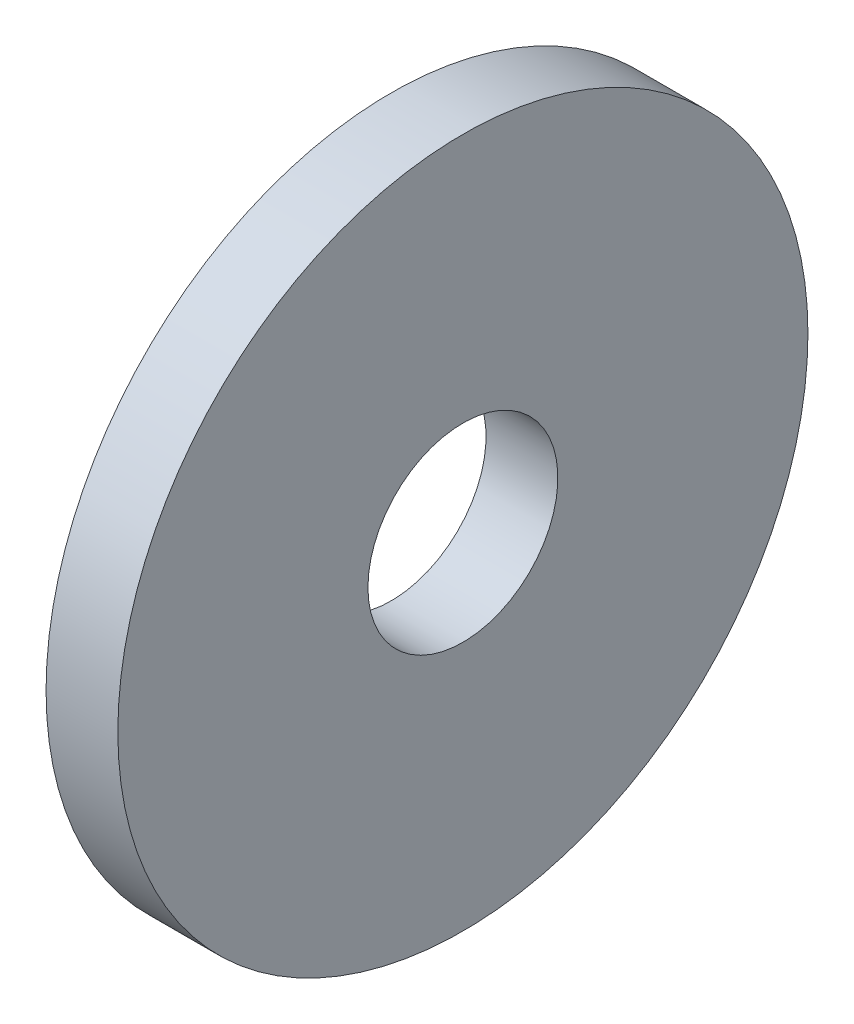
ISO-10303-21;
HEADER;
FILE_DESCRIPTION(('STEP AP214'),'2;1');
FILE_NAME('part.step','',(''),(''),'','','');
FILE_SCHEMA(('AUTOMOTIVE_DESIGN { 1 0 10303 214 1 1 1 1 }'));
ENDSEC;
DATA;
#1=APPLICATION_CONTEXT('core data for automotive mechanical design processes');
#2=APPLICATION_PROTOCOL_DEFINITION('international standard','automotive_design',2000,#1);
#3=PRODUCT_CONTEXT('',#1,'mechanical');
#4=PRODUCT('Part','Part','',(#3));
#5=PRODUCT_RELATED_PRODUCT_CATEGORY('part','',(#4));
#6=PRODUCT_DEFINITION_FORMATION('','',#4);
#7=PRODUCT_DEFINITION_CONTEXT('part definition',#1,'design');
#8=PRODUCT_DEFINITION('design','',#6,#7);
#9=PRODUCT_DEFINITION_SHAPE('','',#8);
#10=(LENGTH_UNIT() NAMED_UNIT(*) SI_UNIT(.MILLI.,.METRE.));
#11=(NAMED_UNIT(*) PLANE_ANGLE_UNIT() SI_UNIT($,.RADIAN.));
#12=(NAMED_UNIT(*) SI_UNIT($,.STERADIAN.) SOLID_ANGLE_UNIT());
#13=UNCERTAINTY_MEASURE_WITH_UNIT(LENGTH_MEASURE(1.E-05),#10,'distance_accuracy_value','');
#14=(GEOMETRIC_REPRESENTATION_CONTEXT(3) GLOBAL_UNCERTAINTY_ASSIGNED_CONTEXT((#13)) GLOBAL_UNIT_ASSIGNED_CONTEXT((#10,
#11,#12)) REPRESENTATION_CONTEXT('',''));
#15=CARTESIAN_POINT('',(0.,0.,0.));
#16=DIRECTION('',(0.,0.,1.));
#17=DIRECTION('',(1.,0.,0.));
#18=AXIS2_PLACEMENT_3D('',#15,#16,#17);
#19=CARTESIAN_POINT('',(3.302,0.,0.));
#20=DIRECTION('',(1.,0.,0.));
#21=DIRECTION('',(0.,0.,-1.));
#22=AXIS2_PLACEMENT_3D('',#19,#20,#21);
#23=PLANE('',#22);
#24=CARTESIAN_POINT('',(3.302,0.,0.));
#25=DIRECTION('',(1.,0.,0.));
#26=DIRECTION('',(0.,0.,-1.));
#27=AXIS2_PLACEMENT_3D('',#24,#25,#26);
#28=CIRCLE('',#27,15.875);
#29=CARTESIAN_POINT('',(3.302,0.,15.875));
#30=VERTEX_POINT('',#29);
#31=EDGE_CURVE('E10',#30,#30,#28,.T.);
#32=ORIENTED_EDGE('',*,*,#31,.T.);
#33=EDGE_LOOP('',(#32));
#34=FACE_BOUND('',#33,.T.);
#35=CARTESIAN_POINT('',(3.302,0.,0.));
#36=DIRECTION('',(1.,0.,0.));
#37=DIRECTION('',(0.,0.,-1.));
#38=AXIS2_PLACEMENT_3D('',#35,#36,#37);
#39=CIRCLE('',#38,4.3688);
#40=CARTESIAN_POINT('',(3.302,0.,4.3688));
#41=VERTEX_POINT('',#40);
#42=EDGE_CURVE('E41',#41,#41,#39,.T.);
#43=ORIENTED_EDGE('',*,*,#42,.F.);
#44=EDGE_LOOP('',(#43));
#45=FACE_BOUND('',#44,.T.);
#46=ADVANCED_FACE('F30',(#34,#45),#23,.T.);
#47=CARTESIAN_POINT('',(0.,0.,0.));
#48=DIRECTION('',(1.,0.,0.));
#49=DIRECTION('',(0.,0.,-1.));
#50=AXIS2_PLACEMENT_3D('',#47,#48,#49);
#51=PLANE('',#50);
#52=CARTESIAN_POINT('',(0.,0.,0.));
#53=DIRECTION('',(1.,0.,0.));
#54=DIRECTION('',(0.,0.,-1.));
#55=AXIS2_PLACEMENT_3D('',#52,#53,#54);
#56=CIRCLE('',#55,15.875);
#57=CARTESIAN_POINT('',(0.,0.,15.875));
#58=VERTEX_POINT('',#57);
#59=EDGE_CURVE('E34',#58,#58,#56,.T.);
#60=ORIENTED_EDGE('',*,*,#59,.F.);
#61=EDGE_LOOP('',(#60));
#62=FACE_BOUND('',#61,.T.);
#63=CARTESIAN_POINT('',(0.,0.,0.));
#64=DIRECTION('',(1.,0.,0.));
#65=DIRECTION('',(0.,0.,-1.));
#66=AXIS2_PLACEMENT_3D('',#63,#64,#65);
#67=CIRCLE('',#66,4.3688);
#68=CARTESIAN_POINT('',(0.,0.,4.3688));
#69=VERTEX_POINT('',#68);
#70=EDGE_CURVE('E43',#69,#69,#67,.T.);
#71=ORIENTED_EDGE('',*,*,#70,.T.);
#72=EDGE_LOOP('',(#71));
#73=FACE_BOUND('',#72,.T.);
#74=ADVANCED_FACE('F53',(#62,#73),#51,.F.);
#75=CARTESIAN_POINT('',(3.302,0.,0.));
#76=DIRECTION('',(-1.,0.,0.));
#77=DIRECTION('',(0.,0.,1.));
#78=AXIS2_PLACEMENT_3D('',#75,#76,#77);
#79=CYLINDRICAL_SURFACE('',#78,15.875);
#80=CARTESIAN_POINT('',(3.302,0.,15.875));
#81=CARTESIAN_POINT('',(3.26760416666667,0.,15.875));
#82=CARTESIAN_POINT('',(3.23320833333333,0.,15.875));
#83=CARTESIAN_POINT('',(3.16441666666667,0.,15.875));
#84=CARTESIAN_POINT('',(3.13002083333333,0.,15.875));
#85=CARTESIAN_POINT('',(3.06122916666667,0.,15.875));
#86=CARTESIAN_POINT('',(3.02683333333333,0.,15.875));
#87=CARTESIAN_POINT('',(2.95804166666667,0.,15.875));
#88=CARTESIAN_POINT('',(2.92364583333333,0.,15.875));
#89=CARTESIAN_POINT('',(2.85485416666667,0.,15.875));
#90=CARTESIAN_POINT('',(2.82045833333333,0.,15.875));
#91=CARTESIAN_POINT('',(2.75166666666667,0.,15.875));
#92=CARTESIAN_POINT('',(2.71727083333333,0.,15.875));
#93=CARTESIAN_POINT('',(2.64847916666667,0.,15.875));
#94=CARTESIAN_POINT('',(2.61408333333333,0.,15.875));
#95=CARTESIAN_POINT('',(2.54529166666667,0.,15.875));
#96=CARTESIAN_POINT('',(2.51089583333333,0.,15.875));
#97=CARTESIAN_POINT('',(2.44210416666667,0.,15.875));
#98=CARTESIAN_POINT('',(2.40770833333333,0.,15.875));
#99=CARTESIAN_POINT('',(2.33891666666667,0.,15.875));
#100=CARTESIAN_POINT('',(2.30452083333333,0.,15.875));
#101=CARTESIAN_POINT('',(2.23572916666667,0.,15.875));
#102=CARTESIAN_POINT('',(2.20133333333333,0.,15.875));
#103=CARTESIAN_POINT('',(2.13254166666667,0.,15.875));
#104=CARTESIAN_POINT('',(2.09814583333333,0.,15.875));
#105=CARTESIAN_POINT('',(2.02935416666667,0.,15.875));
#106=CARTESIAN_POINT('',(1.99495833333333,0.,15.875));
#107=CARTESIAN_POINT('',(1.92616666666667,0.,15.875));
#108=CARTESIAN_POINT('',(1.89177083333333,0.,15.875));
#109=CARTESIAN_POINT('',(1.82297916666667,0.,15.875));
#110=CARTESIAN_POINT('',(1.78858333333333,0.,15.875));
#111=CARTESIAN_POINT('',(1.71979166666667,0.,15.875));
#112=CARTESIAN_POINT('',(1.68539583333333,0.,15.875));
#113=CARTESIAN_POINT('',(1.61660416666667,0.,15.875));
#114=CARTESIAN_POINT('',(1.58220833333333,0.,15.875));
#115=CARTESIAN_POINT('',(1.51341666666667,0.,15.875));
#116=CARTESIAN_POINT('',(1.47902083333333,0.,15.875));
#117=CARTESIAN_POINT('',(1.41022916666667,0.,15.875));
#118=CARTESIAN_POINT('',(1.37583333333333,0.,15.875));
#119=CARTESIAN_POINT('',(1.30704166666667,0.,15.875));
#120=CARTESIAN_POINT('',(1.27264583333333,0.,15.875));
#121=CARTESIAN_POINT('',(1.20385416666667,0.,15.875));
#122=CARTESIAN_POINT('',(1.16945833333333,0.,15.875));
#123=CARTESIAN_POINT('',(1.10066666666667,0.,15.875));
#124=CARTESIAN_POINT('',(1.06627083333333,0.,15.875));
#125=CARTESIAN_POINT('',(0.997479166666666,0.,15.875));
#126=CARTESIAN_POINT('',(0.963083333333333,0.,15.875));
#127=CARTESIAN_POINT('',(0.894291666666666,0.,15.875));
#128=CARTESIAN_POINT('',(0.859895833333333,0.,15.875));
#129=CARTESIAN_POINT('',(0.791104166666666,0.,15.875));
#130=CARTESIAN_POINT('',(0.756708333333333,0.,15.875));
#131=CARTESIAN_POINT('',(0.687916666666667,0.,15.875));
#132=CARTESIAN_POINT('',(0.653520833333333,0.,15.875));
#133=CARTESIAN_POINT('',(0.584729166666667,0.,15.875));
#134=CARTESIAN_POINT('',(0.550333333333333,0.,15.875));
#135=CARTESIAN_POINT('',(0.481541666666667,0.,15.875));
#136=CARTESIAN_POINT('',(0.447145833333333,0.,15.875));
#137=CARTESIAN_POINT('',(0.378354166666667,0.,15.875));
#138=CARTESIAN_POINT('',(0.343958333333333,0.,15.875));
#139=CARTESIAN_POINT('',(0.275166666666667,0.,15.875));
#140=CARTESIAN_POINT('',(0.240770833333333,0.,15.875));
#141=CARTESIAN_POINT('',(0.171979166666667,0.,15.875));
#142=CARTESIAN_POINT('',(0.137583333333333,0.,15.875));
#143=CARTESIAN_POINT('',(0.0687916666666666,0.,15.875));
#144=CARTESIAN_POINT('',(0.0343958333333333,0.,15.875));
#145=CARTESIAN_POINT('',(0.,0.,15.875));
#146=B_SPLINE_CURVE_WITH_KNOTS('',3,(#80,#81,#82,#83,#84,#85,#86,#87,#88,#89,#90,#91,#92,#93,
#94,#95,#96,#97,#98,#99,#100,#101,#102,#103,#104,#105,#106,#107,#108,#109,#110,#111,#112,#113,
#114,#115,#116,#117,#118,#119,#120,#121,#122,#123,#124,#125,#126,#127,#128,#129,#130,#131,#132,
#133,#134,#135,#136,#137,#138,#139,#140,#141,#142,#143,#144,#145),.UNSPECIFIED.,.F.,.F.,(4,2,2,
2,2,2,2,2,2,2,2,2,2,2,2,2,2,2,2,2,2,2,2,2,2,2,2,2,2,2,2,2,4),(0.,0.1031875,0.206375,0.3095625,
0.41275,0.5159375,0.619125,0.7223125,0.8255,0.9286875,1.031875,1.1350625,1.23825,1.3414375,
1.444625,1.5478125,1.651,1.7541875,1.857375,1.9605625,2.06375,2.1669375,2.270125,2.3733125,
2.4765,2.5796875,2.682875,2.7860625,2.88925,2.9924375,3.095625,3.1988125,3.302),.UNSPECIFIED.);
#147=EDGE_CURVE('BSEAM32',#30,#58,#146,.T.);
#148=ORIENTED_EDGE('',*,*,#31,.F.);
#149=ORIENTED_EDGE('',*,*,#59,.T.);
#150=ORIENTED_EDGE('',*,*,#147,.T.);
#151=ORIENTED_EDGE('',*,*,#147,.F.);
#152=EDGE_LOOP('',(#148,#150,#149,#151));
#153=FACE_BOUND('',#152,.T.);
#154=ADVANCED_FACE('F32',(#153),#79,.T.);
#155=CARTESIAN_POINT('',(3.302,0.,0.));
#156=DIRECTION('',(-1.,0.,0.));
#157=DIRECTION('',(0.,0.,1.));
#158=AXIS2_PLACEMENT_3D('',#155,#156,#157);
#159=CYLINDRICAL_SURFACE('',#158,4.3688);
#160=CARTESIAN_POINT('',(3.302,0.,4.3688));
#161=CARTESIAN_POINT('',(3.26760416666667,0.,4.3688));
#162=CARTESIAN_POINT('',(3.23320833333333,0.,4.3688));
#163=CARTESIAN_POINT('',(3.16441666666667,0.,4.3688));
#164=CARTESIAN_POINT('',(3.13002083333333,0.,4.3688));
#165=CARTESIAN_POINT('',(3.06122916666667,0.,4.3688));
#166=CARTESIAN_POINT('',(3.02683333333333,0.,4.3688));
#167=CARTESIAN_POINT('',(2.95804166666667,0.,4.3688));
#168=CARTESIAN_POINT('',(2.92364583333333,0.,4.3688));
#169=CARTESIAN_POINT('',(2.85485416666667,0.,4.3688));
#170=CARTESIAN_POINT('',(2.82045833333333,0.,4.3688));
#171=CARTESIAN_POINT('',(2.75166666666667,0.,4.3688));
#172=CARTESIAN_POINT('',(2.71727083333333,0.,4.3688));
#173=CARTESIAN_POINT('',(2.64847916666667,0.,4.3688));
#174=CARTESIAN_POINT('',(2.61408333333333,0.,4.3688));
#175=CARTESIAN_POINT('',(2.54529166666667,0.,4.3688));
#176=CARTESIAN_POINT('',(2.51089583333333,0.,4.3688));
#177=CARTESIAN_POINT('',(2.44210416666667,0.,4.3688));
#178=CARTESIAN_POINT('',(2.40770833333333,0.,4.3688));
#179=CARTESIAN_POINT('',(2.33891666666667,0.,4.3688));
#180=CARTESIAN_POINT('',(2.30452083333333,0.,4.3688));
#181=CARTESIAN_POINT('',(2.23572916666667,0.,4.3688));
#182=CARTESIAN_POINT('',(2.20133333333333,0.,4.3688));
#183=CARTESIAN_POINT('',(2.13254166666667,0.,4.3688));
#184=CARTESIAN_POINT('',(2.09814583333333,0.,4.3688));
#185=CARTESIAN_POINT('',(2.02935416666667,0.,4.3688));
#186=CARTESIAN_POINT('',(1.99495833333333,0.,4.3688));
#187=CARTESIAN_POINT('',(1.92616666666667,0.,4.3688));
#188=CARTESIAN_POINT('',(1.89177083333333,0.,4.3688));
#189=CARTESIAN_POINT('',(1.82297916666667,0.,4.3688));
#190=CARTESIAN_POINT('',(1.78858333333333,0.,4.3688));
#191=CARTESIAN_POINT('',(1.71979166666667,0.,4.3688));
#192=CARTESIAN_POINT('',(1.68539583333333,0.,4.3688));
#193=CARTESIAN_POINT('',(1.61660416666667,0.,4.3688));
#194=CARTESIAN_POINT('',(1.58220833333333,0.,4.3688));
#195=CARTESIAN_POINT('',(1.51341666666667,0.,4.3688));
#196=CARTESIAN_POINT('',(1.47902083333333,0.,4.3688));
#197=CARTESIAN_POINT('',(1.41022916666667,0.,4.3688));
#198=CARTESIAN_POINT('',(1.37583333333333,0.,4.3688));
#199=CARTESIAN_POINT('',(1.30704166666667,0.,4.3688));
#200=CARTESIAN_POINT('',(1.27264583333333,0.,4.3688));
#201=CARTESIAN_POINT('',(1.20385416666667,0.,4.3688));
#202=CARTESIAN_POINT('',(1.16945833333333,0.,4.3688));
#203=CARTESIAN_POINT('',(1.10066666666667,0.,4.3688));
#204=CARTESIAN_POINT('',(1.06627083333333,0.,4.3688));
#205=CARTESIAN_POINT('',(0.997479166666666,0.,4.3688));
#206=CARTESIAN_POINT('',(0.963083333333333,0.,4.3688));
#207=CARTESIAN_POINT('',(0.894291666666666,0.,4.3688));
#208=CARTESIAN_POINT('',(0.859895833333333,0.,4.3688));
#209=CARTESIAN_POINT('',(0.791104166666666,0.,4.3688));
#210=CARTESIAN_POINT('',(0.756708333333333,0.,4.3688));
#211=CARTESIAN_POINT('',(0.687916666666667,0.,4.3688));
#212=CARTESIAN_POINT('',(0.653520833333333,0.,4.3688));
#213=CARTESIAN_POINT('',(0.584729166666667,0.,4.3688));
#214=CARTESIAN_POINT('',(0.550333333333333,0.,4.3688));
#215=CARTESIAN_POINT('',(0.481541666666667,0.,4.3688));
#216=CARTESIAN_POINT('',(0.447145833333333,0.,4.3688));
#217=CARTESIAN_POINT('',(0.378354166666667,0.,4.3688));
#218=CARTESIAN_POINT('',(0.343958333333333,0.,4.3688));
#219=CARTESIAN_POINT('',(0.275166666666667,0.,4.3688));
#220=CARTESIAN_POINT('',(0.240770833333333,0.,4.3688));
#221=CARTESIAN_POINT('',(0.171979166666667,0.,4.3688));
#222=CARTESIAN_POINT('',(0.137583333333333,0.,4.3688));
#223=CARTESIAN_POINT('',(0.0687916666666666,0.,4.3688));
#224=CARTESIAN_POINT('',(0.0343958333333333,0.,4.3688));
#225=CARTESIAN_POINT('',(0.,0.,4.3688));
#226=B_SPLINE_CURVE_WITH_KNOTS('',3,(#160,#161,#162,#163,#164,#165,#166,#167,#168,#169,#170,
#171,#172,#173,#174,#175,#176,#177,#178,#179,#180,#181,#182,#183,#184,#185,#186,#187,#188,#189,
#190,#191,#192,#193,#194,#195,#196,#197,#198,#199,#200,#201,#202,#203,#204,#205,#206,#207,#208,
#209,#210,#211,#212,#213,#214,#215,#216,#217,#218,#219,#220,#221,#222,#223,#224,#225),
.UNSPECIFIED.,.F.,.F.,(4,2,2,2,2,2,2,2,2,2,2,2,2,2,2,2,2,2,2,2,2,2,2,2,2,2,2,2,2,2,2,2,4),(0.,
0.1031875,0.206375,0.3095625,0.41275,0.5159375,0.619125,0.7223125,0.8255,0.9286875,1.031875,
1.1350625,1.23825,1.3414375,1.444625,1.5478125,1.651,1.7541875,1.857375,1.9605625,2.06375,
2.1669375,2.270125,2.3733125,2.4765,2.5796875,2.682875,2.7860625,2.88925,2.9924375,3.095625,
3.1988125,3.302),.UNSPECIFIED.);
#227=EDGE_CURVE('BSEAM49',#41,#69,#226,.T.);
#228=ORIENTED_EDGE('',*,*,#42,.T.);
#229=ORIENTED_EDGE('',*,*,#70,.F.);
#230=ORIENTED_EDGE('',*,*,#227,.T.);
#231=ORIENTED_EDGE('',*,*,#227,.F.);
#232=EDGE_LOOP('',(#228,#230,#229,#231));
#233=FACE_BOUND('',#232,.T.);
#234=ADVANCED_FACE('F49',(#233),#159,.F.);
#235=CLOSED_SHELL('',(#46,#74,#154,#234));
#236=MANIFOLD_SOLID_BREP('B2',#235);
#237=ADVANCED_BREP_SHAPE_REPRESENTATION('',(#18,#236),#14);
#238=SHAPE_DEFINITION_REPRESENTATION(#9,#237);
ENDSEC;
END-ISO-10303-21;
